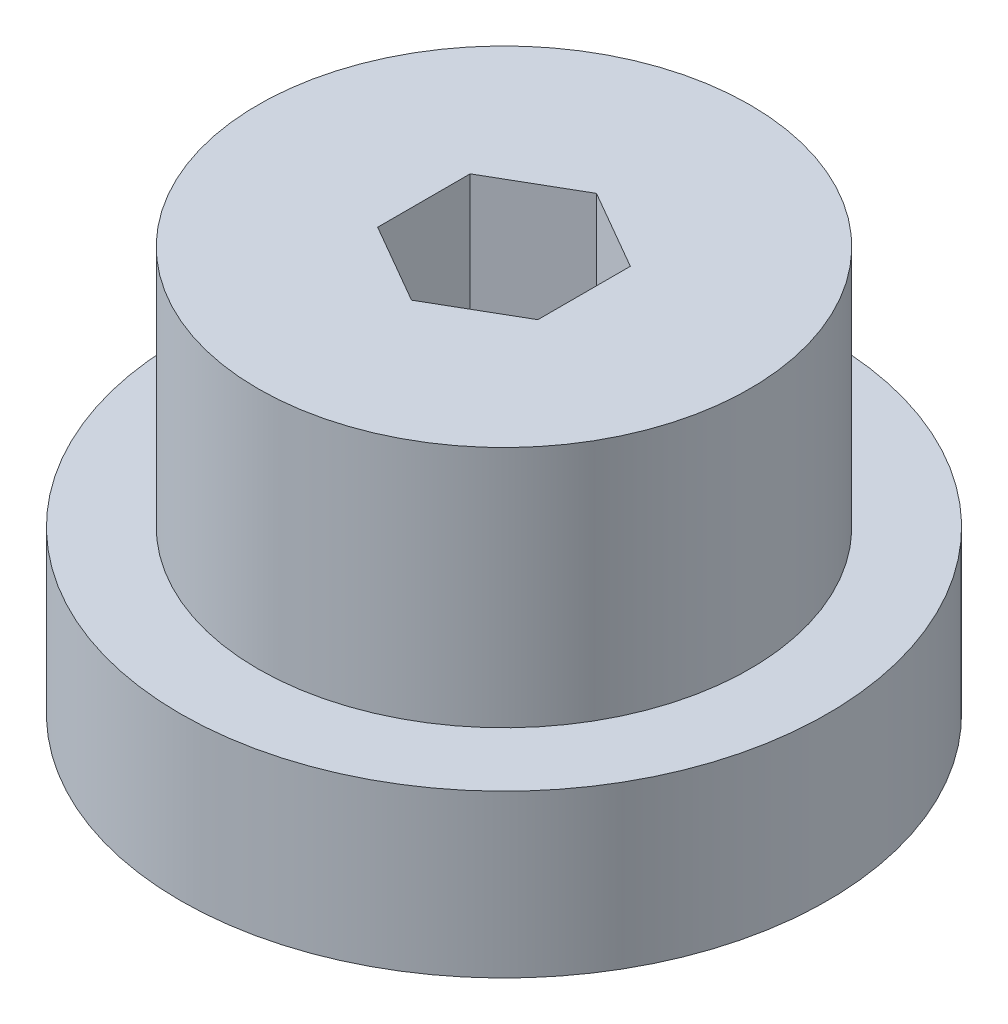
ISO-10303-21;
HEADER;
FILE_DESCRIPTION(('STEP AP214'),'2;1');
FILE_NAME('part.step','',(''),(''),'','','');
FILE_SCHEMA(('AUTOMOTIVE_DESIGN { 1 0 10303 214 1 1 1 1 }'));
ENDSEC;
DATA;
#1=APPLICATION_CONTEXT('core data for automotive mechanical design processes');
#2=APPLICATION_PROTOCOL_DEFINITION('international standard','automotive_design',2000,#1);
#3=PRODUCT_CONTEXT('',#1,'mechanical');
#4=PRODUCT('Part','Part','',(#3));
#5=PRODUCT_RELATED_PRODUCT_CATEGORY('part','',(#4));
#6=PRODUCT_DEFINITION_FORMATION('','',#4);
#7=PRODUCT_DEFINITION_CONTEXT('part definition',#1,'design');
#8=PRODUCT_DEFINITION('design','',#6,#7);
#9=PRODUCT_DEFINITION_SHAPE('','',#8);
#10=(LENGTH_UNIT() NAMED_UNIT(*) SI_UNIT(.MILLI.,.METRE.));
#11=(NAMED_UNIT(*) PLANE_ANGLE_UNIT() SI_UNIT($,.RADIAN.));
#12=(NAMED_UNIT(*) SI_UNIT($,.STERADIAN.) SOLID_ANGLE_UNIT());
#13=UNCERTAINTY_MEASURE_WITH_UNIT(LENGTH_MEASURE(1.E-05),#10,'distance_accuracy_value','');
#14=(GEOMETRIC_REPRESENTATION_CONTEXT(3) GLOBAL_UNCERTAINTY_ASSIGNED_CONTEXT((#13)) GLOBAL_UNIT_ASSIGNED_CONTEXT((#10,
#11,#12)) REPRESENTATION_CONTEXT('',''));
#15=CARTESIAN_POINT('',(0.,0.,0.));
#16=DIRECTION('',(0.,0.,1.));
#17=DIRECTION('',(1.,0.,0.));
#18=AXIS2_PLACEMENT_3D('',#15,#16,#17);
#19=CARTESIAN_POINT('',(0.,5.,0.));
#20=DIRECTION('',(0.,-1.,0.));
#21=DIRECTION('',(0.,0.,-1.));
#22=AXIS2_PLACEMENT_3D('',#19,#20,#21);
#23=CYLINDRICAL_SURFACE('',#22,10.);
#24=CARTESIAN_POINT('',(0.,5.,0.));
#25=DIRECTION('',(0.,1.,0.));
#26=DIRECTION('',(0.,0.,1.));
#27=AXIS2_PLACEMENT_3D('',#24,#25,#26);
#28=CIRCLE('',#27,10.);
#29=CARTESIAN_POINT('',(0.,5.,10.));
#30=VERTEX_POINT('',#29);
#31=EDGE_CURVE('E51',#30,#30,#28,.T.);
#32=ORIENTED_EDGE('',*,*,#31,.F.);
#33=EDGE_LOOP('',(#32));
#34=FACE_BOUND('',#33,.T.);
#35=CARTESIAN_POINT('',(0.,0.,0.));
#36=DIRECTION('',(0.,1.,0.));
#37=DIRECTION('',(0.,0.,1.));
#38=AXIS2_PLACEMENT_3D('',#35,#36,#37);
#39=CIRCLE('',#38,10.);
#40=CARTESIAN_POINT('',(0.,0.,10.));
#41=VERTEX_POINT('',#40);
#42=EDGE_CURVE('E46',#41,#41,#39,.T.);
#43=ORIENTED_EDGE('',*,*,#42,.T.);
#44=EDGE_LOOP('',(#43));
#45=FACE_BOUND('',#44,.T.);
#46=ADVANCED_FACE('F43',(#34,#45),#23,.T.);
#47=CARTESIAN_POINT('',(0.,5.,0.));
#48=DIRECTION('',(0.,1.,0.));
#49=DIRECTION('',(0.,0.,1.));
#50=AXIS2_PLACEMENT_3D('',#47,#48,#49);
#51=PLANE('',#50);
#52=CARTESIAN_POINT('',(0.,5.,0.));
#53=DIRECTION('',(0.,1.,0.));
#54=DIRECTION('',(0.,0.,1.));
#55=AXIS2_PLACEMENT_3D('',#52,#53,#54);
#56=CIRCLE('',#55,7.6);
#57=CARTESIAN_POINT('',(0.,5.,7.6));
#58=VERTEX_POINT('',#57);
#59=EDGE_CURVE('E11',#58,#58,#56,.T.);
#60=ORIENTED_EDGE('',*,*,#59,.F.);
#61=EDGE_LOOP('',(#60));
#62=FACE_BOUND('',#61,.T.);
#63=ORIENTED_EDGE('',*,*,#31,.T.);
#64=EDGE_LOOP('',(#63));
#65=FACE_BOUND('',#64,.T.);
#66=ADVANCED_FACE('F155',(#62,#65),#51,.T.);
#67=CARTESIAN_POINT('',(0.,0.,0.));
#68=DIRECTION('',(0.,1.,0.));
#69=DIRECTION('',(0.,0.,1.));
#70=AXIS2_PLACEMENT_3D('',#67,#68,#69);
#71=PLANE('',#70);
#72=DIRECTION('',(-0.866025403784439,0.,0.5));
#73=VECTOR('',#72,1.);
#74=CARTESIAN_POINT('',(0.,0.,2.85788383248865));
#75=LINE('',#74,#73);
#76=CARTESIAN_POINT('',(2.475,0.,1.42894191624432));
#77=VERTEX_POINT('',#76);
#78=CARTESIAN_POINT('',(0.,0.,2.85788383248865));
#79=VERTEX_POINT('',#78);
#80=EDGE_CURVE('E118',#77,#79,#75,.T.);
#81=ORIENTED_EDGE('',*,*,#80,.F.);
#82=DIRECTION('',(0.,0.,1.));
#83=VECTOR('',#82,1.);
#84=CARTESIAN_POINT('',(2.475,0.,1.42894191624432));
#85=LINE('',#84,#83);
#86=CARTESIAN_POINT('',(2.475,0.,-1.42894191624432));
#87=VERTEX_POINT('',#86);
#88=EDGE_CURVE('E99',#87,#77,#85,.T.);
#89=ORIENTED_EDGE('',*,*,#88,.F.);
#90=DIRECTION('',(0.866025403784439,0.,0.5));
#91=VECTOR('',#90,1.);
#92=CARTESIAN_POINT('',(2.475,0.,-1.42894191624432));
#93=LINE('',#92,#91);
#94=CARTESIAN_POINT('',(0.,0.,-2.85788383248865));
#95=VERTEX_POINT('',#94);
#96=EDGE_CURVE('E108',#95,#87,#93,.T.);
#97=ORIENTED_EDGE('',*,*,#96,.F.);
#98=DIRECTION('',(0.866025403784439,0.,-0.5));
#99=VECTOR('',#98,1.);
#100=CARTESIAN_POINT('',(0.,0.,-2.85788383248865));
#101=LINE('',#100,#99);
#102=CARTESIAN_POINT('',(-2.475,0.,-1.42894191624432));
#103=VERTEX_POINT('',#102);
#104=EDGE_CURVE('E59',#103,#95,#101,.T.);
#105=ORIENTED_EDGE('',*,*,#104,.F.);
#106=DIRECTION('',(0.,0.,-1.));
#107=VECTOR('',#106,1.);
#108=CARTESIAN_POINT('',(-2.475,0.,-1.42894191624432));
#109=LINE('',#108,#107);
#110=CARTESIAN_POINT('',(-2.475,0.,1.42894191624432));
#111=VERTEX_POINT('',#110);
#112=EDGE_CURVE('E252',#111,#103,#109,.T.);
#113=ORIENTED_EDGE('',*,*,#112,.F.);
#114=DIRECTION('',(-0.866025403784439,0.,-0.5));
#115=VECTOR('',#114,1.);
#116=CARTESIAN_POINT('',(-2.475,0.,1.42894191624432));
#117=LINE('',#116,#115);
#118=EDGE_CURVE('E122',#79,#111,#117,.T.);
#119=ORIENTED_EDGE('',*,*,#118,.F.);
#120=EDGE_LOOP('',(#81,#89,#97,#105,#113,#119));
#121=FACE_BOUND('',#120,.T.);
#122=ORIENTED_EDGE('',*,*,#42,.F.);
#123=EDGE_LOOP('',(#122));
#124=FACE_BOUND('',#123,.T.);
#125=ADVANCED_FACE('F114',(#121,#124),#71,.F.);
#126=CARTESIAN_POINT('',(0.,12.5,0.));
#127=DIRECTION('',(0.,-1.,0.));
#128=DIRECTION('',(0.,0.,-1.));
#129=AXIS2_PLACEMENT_3D('',#126,#127,#128);
#130=CYLINDRICAL_SURFACE('',#129,7.6);
#131=CARTESIAN_POINT('',(0.,12.5,0.));
#132=DIRECTION('',(0.,1.,0.));
#133=DIRECTION('',(0.,0.,1.));
#134=AXIS2_PLACEMENT_3D('',#131,#132,#133);
#135=CIRCLE('',#134,7.6);
#136=CARTESIAN_POINT('',(0.,12.5,7.6));
#137=VERTEX_POINT('',#136);
#138=EDGE_CURVE('E111',#137,#137,#135,.T.);
#139=ORIENTED_EDGE('',*,*,#138,.F.);
#140=EDGE_LOOP('',(#139));
#141=FACE_BOUND('',#140,.T.);
#142=ORIENTED_EDGE('',*,*,#59,.T.);
#143=EDGE_LOOP('',(#142));
#144=FACE_BOUND('',#143,.T.);
#145=ADVANCED_FACE('F154',(#141,#144),#130,.T.);
#146=CARTESIAN_POINT('',(0.,12.5,0.));
#147=DIRECTION('',(0.,1.,0.));
#148=DIRECTION('',(0.,0.,1.));
#149=AXIS2_PLACEMENT_3D('',#146,#147,#148);
#150=PLANE('',#149);
#151=DIRECTION('',(0.,0.,-1.));
#152=VECTOR('',#151,1.);
#153=CARTESIAN_POINT('',(2.475,12.5,1.42894191624432));
#154=LINE('',#153,#152);
#155=CARTESIAN_POINT('',(2.475,12.5,1.42894191624432));
#156=VERTEX_POINT('',#155);
#157=CARTESIAN_POINT('',(2.475,12.5,-1.42894191624432));
#158=VERTEX_POINT('',#157);
#159=EDGE_CURVE('E67',#156,#158,#154,.T.);
#160=ORIENTED_EDGE('',*,*,#159,.F.);
#161=DIRECTION('',(0.866025403784439,0.,-0.5));
#162=VECTOR('',#161,1.);
#163=CARTESIAN_POINT('',(0.,12.5,2.85788383248865));
#164=LINE('',#163,#162);
#165=CARTESIAN_POINT('',(0.,12.5,2.85788383248865));
#166=VERTEX_POINT('',#165);
#167=EDGE_CURVE('E105',#166,#156,#164,.T.);
#168=ORIENTED_EDGE('',*,*,#167,.F.);
#169=DIRECTION('',(0.866025403784439,0.,0.5));
#170=VECTOR('',#169,1.);
#171=CARTESIAN_POINT('',(-2.475,12.5,1.42894191624432));
#172=LINE('',#171,#170);
#173=CARTESIAN_POINT('',(-2.475,12.5,1.42894191624432));
#174=VERTEX_POINT('',#173);
#175=EDGE_CURVE('E133',#174,#166,#172,.T.);
#176=ORIENTED_EDGE('',*,*,#175,.F.);
#177=DIRECTION('',(0.,0.,1.));
#178=VECTOR('',#177,1.);
#179=CARTESIAN_POINT('',(-2.475,12.5,-1.42894191624432));
#180=LINE('',#179,#178);
#181=CARTESIAN_POINT('',(-2.475,12.5,-1.42894191624432));
#182=VERTEX_POINT('',#181);
#183=EDGE_CURVE('E130',#182,#174,#180,.T.);
#184=ORIENTED_EDGE('',*,*,#183,.F.);
#185=DIRECTION('',(-0.866025403784439,0.,0.5));
#186=VECTOR('',#185,1.);
#187=CARTESIAN_POINT('',(0.,12.5,-2.85788383248865));
#188=LINE('',#187,#186);
#189=CARTESIAN_POINT('',(0.,12.5,-2.85788383248865));
#190=VERTEX_POINT('',#189);
#191=EDGE_CURVE('E127',#190,#182,#188,.T.);
#192=ORIENTED_EDGE('',*,*,#191,.F.);
#193=DIRECTION('',(-0.866025403784439,0.,-0.5));
#194=VECTOR('',#193,1.);
#195=CARTESIAN_POINT('',(2.475,12.5,-1.42894191624432));
#196=LINE('',#195,#194);
#197=EDGE_CURVE('E120',#158,#190,#196,.T.);
#198=ORIENTED_EDGE('',*,*,#197,.F.);
#199=EDGE_LOOP('',(#160,#168,#176,#184,#192,#198));
#200=FACE_BOUND('',#199,.T.);
#201=ORIENTED_EDGE('',*,*,#138,.T.);
#202=EDGE_LOOP('',(#201));
#203=FACE_BOUND('',#202,.T.);
#204=ADVANCED_FACE('F160',(#200,#203),#150,.T.);
#205=CARTESIAN_POINT('',(2.475,-0.000999999999999265,1.42894191624432));
#206=DIRECTION('',(1.,0.,0.));
#207=DIRECTION('',(0.,0.,-1.));
#208=AXIS2_PLACEMENT_3D('',#205,#206,#207);
#209=PLANE('',#208);
#210=ORIENTED_EDGE('',*,*,#88,.T.);
#211=DIRECTION('',(0.,1.,0.));
#212=VECTOR('',#211,1.);
#213=CARTESIAN_POINT('',(2.475,-0.000999999999999265,1.42894191624432));
#214=LINE('',#213,#212);
#215=EDGE_CURVE('E112',#77,#156,#214,.T.);
#216=ORIENTED_EDGE('',*,*,#215,.T.);
#217=ORIENTED_EDGE('',*,*,#159,.T.);
#218=DIRECTION('',(0.,1.,0.));
#219=VECTOR('',#218,1.);
#220=CARTESIAN_POINT('',(2.475,-0.000999999999999265,-1.42894191624432));
#221=LINE('',#220,#219);
#222=EDGE_CURVE('E95',#87,#158,#221,.T.);
#223=ORIENTED_EDGE('',*,*,#222,.F.);
#224=EDGE_LOOP('',(#210,#216,#217,#223));
#225=FACE_BOUND('',#224,.T.);
#226=ADVANCED_FACE('F97',(#225),#209,.F.);
#227=CARTESIAN_POINT('',(0.,-0.000999999999999265,2.85788383248865));
#228=DIRECTION('',(0.5,0.,0.866025403784439));
#229=DIRECTION('',(0.866025403784439,0.,-0.5));
#230=AXIS2_PLACEMENT_3D('',#227,#228,#229);
#231=PLANE('',#230);
#232=ORIENTED_EDGE('',*,*,#80,.T.);
#233=DIRECTION('',(0.,1.,0.));
#234=VECTOR('',#233,1.);
#235=CARTESIAN_POINT('',(0.,-0.000999999999999265,2.85788383248865));
#236=LINE('',#235,#234);
#237=EDGE_CURVE('E139',#79,#166,#236,.T.);
#238=ORIENTED_EDGE('',*,*,#237,.T.);
#239=ORIENTED_EDGE('',*,*,#167,.T.);
#240=ORIENTED_EDGE('',*,*,#215,.F.);
#241=EDGE_LOOP('',(#232,#238,#239,#240));
#242=FACE_BOUND('',#241,.T.);
#243=ADVANCED_FACE('F201',(#242),#231,.F.);
#244=CARTESIAN_POINT('',(-2.475,-0.000999999999999265,1.42894191624432));
#245=DIRECTION('',(-0.5,0.,0.866025403784439));
#246=DIRECTION('',(0.866025403784439,0.,0.5));
#247=AXIS2_PLACEMENT_3D('',#244,#245,#246);
#248=PLANE('',#247);
#249=ORIENTED_EDGE('',*,*,#118,.T.);
#250=DIRECTION('',(0.,1.,0.));
#251=VECTOR('',#250,1.);
#252=CARTESIAN_POINT('',(-2.475,-0.000999999999999265,1.42894191624432));
#253=LINE('',#252,#251);
#254=EDGE_CURVE('E141',#111,#174,#253,.T.);
#255=ORIENTED_EDGE('',*,*,#254,.T.);
#256=ORIENTED_EDGE('',*,*,#175,.T.);
#257=ORIENTED_EDGE('',*,*,#237,.F.);
#258=EDGE_LOOP('',(#249,#255,#256,#257));
#259=FACE_BOUND('',#258,.T.);
#260=ADVANCED_FACE('F210',(#259),#248,.F.);
#261=CARTESIAN_POINT('',(-2.475,-0.000999999999999265,-1.42894191624432));
#262=DIRECTION('',(-1.,0.,0.));
#263=DIRECTION('',(0.,0.,1.));
#264=AXIS2_PLACEMENT_3D('',#261,#262,#263);
#265=PLANE('',#264);
#266=ORIENTED_EDGE('',*,*,#112,.T.);
#267=DIRECTION('',(0.,1.,0.));
#268=VECTOR('',#267,1.);
#269=CARTESIAN_POINT('',(-2.475,-0.000999999999999265,-1.42894191624432));
#270=LINE('',#269,#268);
#271=EDGE_CURVE('E143',#103,#182,#270,.T.);
#272=ORIENTED_EDGE('',*,*,#271,.T.);
#273=ORIENTED_EDGE('',*,*,#183,.T.);
#274=ORIENTED_EDGE('',*,*,#254,.F.);
#275=EDGE_LOOP('',(#266,#272,#273,#274));
#276=FACE_BOUND('',#275,.T.);
#277=ADVANCED_FACE('F220',(#276),#265,.F.);
#278=CARTESIAN_POINT('',(0.,-0.000999999999999265,-2.85788383248865));
#279=DIRECTION('',(-0.5,0.,-0.866025403784439));
#280=DIRECTION('',(-0.866025403784439,0.,0.5));
#281=AXIS2_PLACEMENT_3D('',#278,#279,#280);
#282=PLANE('',#281);
#283=ORIENTED_EDGE('',*,*,#104,.T.);
#284=DIRECTION('',(0.,1.,0.));
#285=VECTOR('',#284,1.);
#286=CARTESIAN_POINT('',(0.,-0.000999999999999265,-2.85788383248865));
#287=LINE('',#286,#285);
#288=EDGE_CURVE('E104',#95,#190,#287,.T.);
#289=ORIENTED_EDGE('',*,*,#288,.T.);
#290=ORIENTED_EDGE('',*,*,#191,.T.);
#291=ORIENTED_EDGE('',*,*,#271,.F.);
#292=EDGE_LOOP('',(#283,#289,#290,#291));
#293=FACE_BOUND('',#292,.T.);
#294=ADVANCED_FACE('F230',(#293),#282,.F.);
#295=CARTESIAN_POINT('',(2.475,-0.000999999999999265,-1.42894191624432));
#296=DIRECTION('',(0.5,0.,-0.866025403784439));
#297=DIRECTION('',(-0.866025403784439,0.,-0.5));
#298=AXIS2_PLACEMENT_3D('',#295,#296,#297);
#299=PLANE('',#298);
#300=ORIENTED_EDGE('',*,*,#96,.T.);
#301=ORIENTED_EDGE('',*,*,#222,.T.);
#302=ORIENTED_EDGE('',*,*,#197,.T.);
#303=ORIENTED_EDGE('',*,*,#288,.F.);
#304=EDGE_LOOP('',(#300,#301,#302,#303));
#305=FACE_BOUND('',#304,.T.);
#306=ADVANCED_FACE('F109',(#305),#299,.F.);
#307=CLOSED_SHELL('',(#46,#66,#125,#145,#204,#226,#243,#260,#277,#294,#306));
#308=MANIFOLD_SOLID_BREP('B2',#307);
#309=ADVANCED_BREP_SHAPE_REPRESENTATION('',(#18,#308),#14);
#310=SHAPE_DEFINITION_REPRESENTATION(#9,#309);
ENDSEC;
END-ISO-10303-21;
